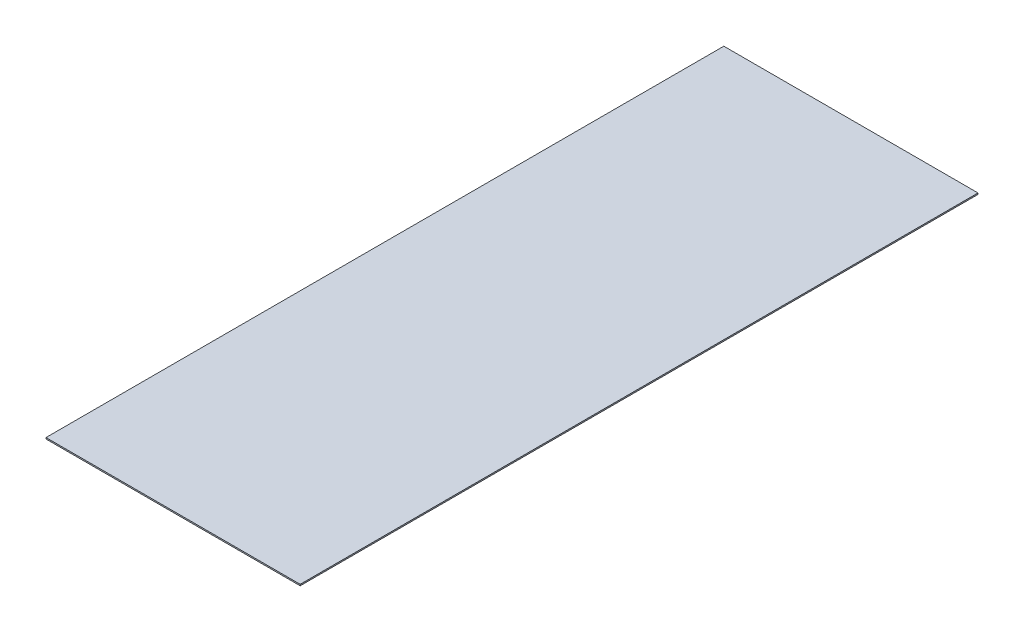
ISO-10303-21;
HEADER;
FILE_DESCRIPTION(('STEP AP214'),'2;1');
FILE_NAME('part.step','',(''),(''),'','','');
FILE_SCHEMA(('AUTOMOTIVE_DESIGN { 1 0 10303 214 1 1 1 1 }'));
ENDSEC;
DATA;
#1=APPLICATION_CONTEXT('core data for automotive mechanical design processes');
#2=APPLICATION_PROTOCOL_DEFINITION('international standard','automotive_design',2000,#1);
#3=PRODUCT_CONTEXT('',#1,'mechanical');
#4=PRODUCT('Part','Part','',(#3));
#5=PRODUCT_RELATED_PRODUCT_CATEGORY('part','',(#4));
#6=PRODUCT_DEFINITION_FORMATION('','',#4);
#7=PRODUCT_DEFINITION_CONTEXT('part definition',#1,'design');
#8=PRODUCT_DEFINITION('design','',#6,#7);
#9=PRODUCT_DEFINITION_SHAPE('','',#8);
#10=(LENGTH_UNIT() NAMED_UNIT(*) SI_UNIT(.MILLI.,.METRE.));
#11=(NAMED_UNIT(*) PLANE_ANGLE_UNIT() SI_UNIT($,.RADIAN.));
#12=(NAMED_UNIT(*) SI_UNIT($,.STERADIAN.) SOLID_ANGLE_UNIT());
#13=UNCERTAINTY_MEASURE_WITH_UNIT(LENGTH_MEASURE(1.E-05),#10,'distance_accuracy_value','');
#14=(GEOMETRIC_REPRESENTATION_CONTEXT(3) GLOBAL_UNCERTAINTY_ASSIGNED_CONTEXT((#13)) GLOBAL_UNIT_ASSIGNED_CONTEXT((#10,
#11,#12)) REPRESENTATION_CONTEXT('',''));
#15=CARTESIAN_POINT('',(0.,0.,0.));
#16=DIRECTION('',(0.,0.,1.));
#17=DIRECTION('',(1.,0.,0.));
#18=AXIS2_PLACEMENT_3D('',#15,#16,#17);
#19=CARTESIAN_POINT('',(457.2,4.8,1219.2));
#20=DIRECTION('',(-1.,0.,0.));
#21=DIRECTION('',(0.,0.,1.));
#22=AXIS2_PLACEMENT_3D('',#19,#20,#21);
#23=PLANE('',#22);
#24=DIRECTION('',(0.,0.,-1.));
#25=VECTOR('',#24,1.);
#26=CARTESIAN_POINT('',(457.2,0.,1219.2));
#27=LINE('',#26,#25);
#28=CARTESIAN_POINT('',(457.2,0.,1219.2));
#29=VERTEX_POINT('',#28);
#30=CARTESIAN_POINT('',(457.2,0.,-1219.2));
#31=VERTEX_POINT('',#30);
#32=EDGE_CURVE('E96',#29,#31,#27,.T.);
#33=ORIENTED_EDGE('',*,*,#32,.T.);
#34=DIRECTION('',(0.,-1.,0.));
#35=VECTOR('',#34,1.);
#36=CARTESIAN_POINT('',(457.2,4.8,-1219.2));
#37=LINE('',#36,#35);
#38=CARTESIAN_POINT('',(457.2,4.8,-1219.2));
#39=VERTEX_POINT('',#38);
#40=EDGE_CURVE('E11',#39,#31,#37,.T.);
#41=ORIENTED_EDGE('',*,*,#40,.F.);
#42=DIRECTION('',(0.,0.,-1.));
#43=VECTOR('',#42,1.);
#44=CARTESIAN_POINT('',(457.2,4.8,1219.2));
#45=LINE('',#44,#43);
#46=CARTESIAN_POINT('',(457.2,4.8,1219.2));
#47=VERTEX_POINT('',#46);
#48=EDGE_CURVE('E84',#47,#39,#45,.T.);
#49=ORIENTED_EDGE('',*,*,#48,.F.);
#50=DIRECTION('',(0.,-1.,0.));
#51=VECTOR('',#50,1.);
#52=CARTESIAN_POINT('',(457.2,4.8,1219.2));
#53=LINE('',#52,#51);
#54=EDGE_CURVE('E92',#47,#29,#53,.T.);
#55=ORIENTED_EDGE('',*,*,#54,.T.);
#56=EDGE_LOOP('',(#33,#41,#49,#55));
#57=FACE_BOUND('',#56,.T.);
#58=ADVANCED_FACE('F33',(#57),#23,.F.);
#59=CARTESIAN_POINT('',(-457.2,4.8,-1219.2));
#60=DIRECTION('',(0.,0.,1.));
#61=DIRECTION('',(1.,0.,0.));
#62=AXIS2_PLACEMENT_3D('',#59,#60,#61);
#63=PLANE('',#62);
#64=DIRECTION('',(-1.,0.,0.));
#65=VECTOR('',#64,1.);
#66=CARTESIAN_POINT('',(-457.2,0.,-1219.2));
#67=LINE('',#66,#65);
#68=CARTESIAN_POINT('',(-457.2,0.,-1219.2));
#69=VERTEX_POINT('',#68);
#70=EDGE_CURVE('E88',#31,#69,#67,.T.);
#71=ORIENTED_EDGE('',*,*,#70,.T.);
#72=DIRECTION('',(0.,-1.,0.));
#73=VECTOR('',#72,1.);
#74=CARTESIAN_POINT('',(-457.2,4.8,-1219.2));
#75=LINE('',#74,#73);
#76=CARTESIAN_POINT('',(-457.2,4.8,-1219.2));
#77=VERTEX_POINT('',#76);
#78=EDGE_CURVE('E41',#77,#69,#75,.T.);
#79=ORIENTED_EDGE('',*,*,#78,.F.);
#80=DIRECTION('',(-1.,0.,0.));
#81=VECTOR('',#80,1.);
#82=CARTESIAN_POINT('',(-457.2,4.8,-1219.2));
#83=LINE('',#82,#81);
#84=EDGE_CURVE('E79',#39,#77,#83,.T.);
#85=ORIENTED_EDGE('',*,*,#84,.F.);
#86=ORIENTED_EDGE('',*,*,#40,.T.);
#87=EDGE_LOOP('',(#71,#79,#85,#86));
#88=FACE_BOUND('',#87,.T.);
#89=ADVANCED_FACE('F87',(#88),#63,.F.);
#90=CARTESIAN_POINT('',(-457.2,4.8,1219.2));
#91=DIRECTION('',(1.,0.,0.));
#92=DIRECTION('',(0.,0.,-1.));
#93=AXIS2_PLACEMENT_3D('',#90,#91,#92);
#94=PLANE('',#93);
#95=DIRECTION('',(0.,0.,1.));
#96=VECTOR('',#95,1.);
#97=CARTESIAN_POINT('',(-457.2,0.,1219.2));
#98=LINE('',#97,#96);
#99=CARTESIAN_POINT('',(-457.2,0.,1219.2));
#100=VERTEX_POINT('',#99);
#101=EDGE_CURVE('E66',#69,#100,#98,.T.);
#102=ORIENTED_EDGE('',*,*,#101,.T.);
#103=DIRECTION('',(0.,-1.,0.));
#104=VECTOR('',#103,1.);
#105=CARTESIAN_POINT('',(-457.2,4.8,1219.2));
#106=LINE('',#105,#104);
#107=CARTESIAN_POINT('',(-457.2,4.8,1219.2));
#108=VERTEX_POINT('',#107);
#109=EDGE_CURVE('E89',#108,#100,#106,.T.);
#110=ORIENTED_EDGE('',*,*,#109,.F.);
#111=DIRECTION('',(0.,0.,1.));
#112=VECTOR('',#111,1.);
#113=CARTESIAN_POINT('',(-457.2,4.8,1219.2));
#114=LINE('',#113,#112);
#115=EDGE_CURVE('E82',#77,#108,#114,.T.);
#116=ORIENTED_EDGE('',*,*,#115,.F.);
#117=ORIENTED_EDGE('',*,*,#78,.T.);
#118=EDGE_LOOP('',(#102,#110,#116,#117));
#119=FACE_BOUND('',#118,.T.);
#120=ADVANCED_FACE('F90',(#119),#94,.F.);
#121=CARTESIAN_POINT('',(-457.2,4.8,1219.2));
#122=DIRECTION('',(0.,0.,-1.));
#123=DIRECTION('',(-1.,0.,0.));
#124=AXIS2_PLACEMENT_3D('',#121,#122,#123);
#125=PLANE('',#124);
#126=DIRECTION('',(1.,0.,0.));
#127=VECTOR('',#126,1.);
#128=CARTESIAN_POINT('',(-457.2,0.,1219.2));
#129=LINE('',#128,#127);
#130=EDGE_CURVE('E72',#100,#29,#129,.T.);
#131=ORIENTED_EDGE('',*,*,#130,.T.);
#132=ORIENTED_EDGE('',*,*,#54,.F.);
#133=DIRECTION('',(1.,0.,0.));
#134=VECTOR('',#133,1.);
#135=CARTESIAN_POINT('',(-457.2,4.8,1219.2));
#136=LINE('',#135,#134);
#137=EDGE_CURVE('E49',#108,#47,#136,.T.);
#138=ORIENTED_EDGE('',*,*,#137,.F.);
#139=ORIENTED_EDGE('',*,*,#109,.T.);
#140=EDGE_LOOP('',(#131,#132,#138,#139));
#141=FACE_BOUND('',#140,.T.);
#142=ADVANCED_FACE('F103',(#141),#125,.F.);
#143=CARTESIAN_POINT('',(0.,4.8,0.));
#144=DIRECTION('',(0.,-1.,0.));
#145=DIRECTION('',(0.,0.,-1.));
#146=AXIS2_PLACEMENT_3D('',#143,#144,#145);
#147=PLANE('',#146);
#148=ORIENTED_EDGE('',*,*,#48,.T.);
#149=ORIENTED_EDGE('',*,*,#84,.T.);
#150=ORIENTED_EDGE('',*,*,#115,.T.);
#151=ORIENTED_EDGE('',*,*,#137,.T.);
#152=EDGE_LOOP('',(#148,#149,#150,#151));
#153=FACE_BOUND('',#152,.T.);
#154=ADVANCED_FACE('F80',(#153),#147,.F.);
#155=CARTESIAN_POINT('',(0.,0.,0.));
#156=DIRECTION('',(0.,-1.,0.));
#157=DIRECTION('',(0.,0.,-1.));
#158=AXIS2_PLACEMENT_3D('',#155,#156,#157);
#159=PLANE('',#158);
#160=ORIENTED_EDGE('',*,*,#32,.F.);
#161=ORIENTED_EDGE('',*,*,#130,.F.);
#162=ORIENTED_EDGE('',*,*,#101,.F.);
#163=ORIENTED_EDGE('',*,*,#70,.F.);
#164=EDGE_LOOP('',(#160,#161,#162,#163));
#165=FACE_BOUND('',#164,.T.);
#166=ADVANCED_FACE('F106',(#165),#159,.T.);
#167=CLOSED_SHELL('',(#58,#89,#120,#142,#154,#166));
#168=MANIFOLD_SOLID_BREP('B2',#167);
#169=ADVANCED_BREP_SHAPE_REPRESENTATION('',(#18,#168),#14);
#170=SHAPE_DEFINITION_REPRESENTATION(#9,#169);
ENDSEC;
END-ISO-10303-21;
